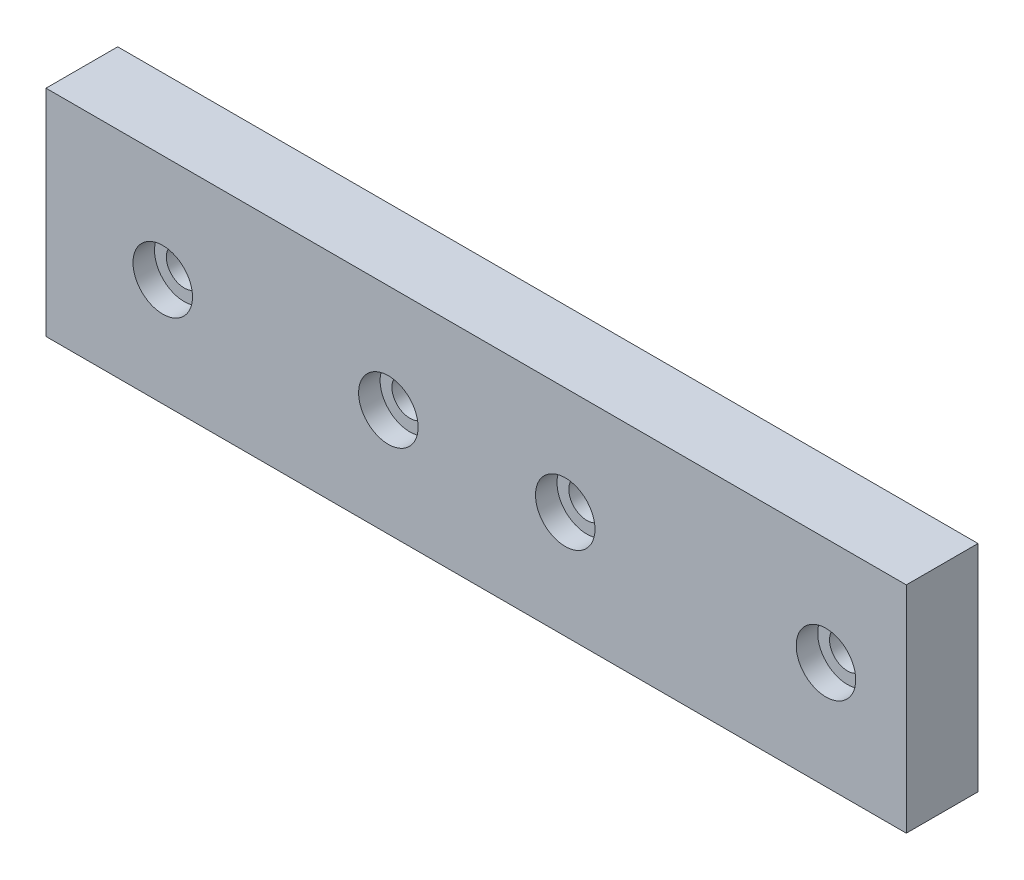
ISO-10303-21;
HEADER;
FILE_DESCRIPTION(('STEP AP214'),'2;1');
FILE_NAME('part.step','',(''),(''),'','','');
FILE_SCHEMA(('AUTOMOTIVE_DESIGN { 1 0 10303 214 1 1 1 1 }'));
ENDSEC;
DATA;
#1=APPLICATION_CONTEXT('core data for automotive mechanical design processes');
#2=APPLICATION_PROTOCOL_DEFINITION('international standard','automotive_design',2000,#1);
#3=PRODUCT_CONTEXT('',#1,'mechanical');
#4=PRODUCT('Part','Part','',(#3));
#5=PRODUCT_RELATED_PRODUCT_CATEGORY('part','',(#4));
#6=PRODUCT_DEFINITION_FORMATION('','',#4);
#7=PRODUCT_DEFINITION_CONTEXT('part definition',#1,'design');
#8=PRODUCT_DEFINITION('design','',#6,#7);
#9=PRODUCT_DEFINITION_SHAPE('','',#8);
#10=(LENGTH_UNIT() NAMED_UNIT(*) SI_UNIT(.MILLI.,.METRE.));
#11=(NAMED_UNIT(*) PLANE_ANGLE_UNIT() SI_UNIT($,.RADIAN.));
#12=(NAMED_UNIT(*) SI_UNIT($,.STERADIAN.) SOLID_ANGLE_UNIT());
#13=UNCERTAINTY_MEASURE_WITH_UNIT(LENGTH_MEASURE(1.E-05),#10,'distance_accuracy_value','');
#14=(GEOMETRIC_REPRESENTATION_CONTEXT(3) GLOBAL_UNCERTAINTY_ASSIGNED_CONTEXT((#13)) GLOBAL_UNIT_ASSIGNED_CONTEXT((#10,
#11,#12)) REPRESENTATION_CONTEXT('',''));
#15=CARTESIAN_POINT('',(0.,0.,0.));
#16=DIRECTION('',(0.,0.,1.));
#17=DIRECTION('',(1.,0.,0.));
#18=AXIS2_PLACEMENT_3D('',#15,#16,#17);
#19=CARTESIAN_POINT('',(-6.70657386989236,15.,40.));
#20=DIRECTION('',(0.,0.,-1.));
#21=DIRECTION('',(-1.,0.,0.));
#22=AXIS2_PLACEMENT_3D('',#19,#20,#21);
#23=CYLINDRICAL_SURFACE('',#22,2.5);
#24=CARTESIAN_POINT('',(-6.70657386989237,15.,17.5));
#25=DIRECTION('',(0.,0.,1.));
#26=DIRECTION('',(1.,0.,0.));
#27=AXIS2_PLACEMENT_3D('',#24,#25,#26);
#28=CIRCLE('',#27,2.5);
#29=CARTESIAN_POINT('',(-4.20657386989237,15.,17.5));
#30=VERTEX_POINT('',#29);
#31=EDGE_CURVE('E111',#30,#30,#28,.T.);
#32=ORIENTED_EDGE('',*,*,#31,.F.);
#33=EDGE_LOOP('',(#32));
#34=FACE_BOUND('',#33,.T.);
#35=CARTESIAN_POINT('',(-6.70657386989237,15.,24.5));
#36=DIRECTION('',(0.,0.,1.));
#37=DIRECTION('',(1.,0.,0.));
#38=AXIS2_PLACEMENT_3D('',#35,#36,#37);
#39=CIRCLE('',#38,2.5);
#40=CARTESIAN_POINT('',(-4.20657386989237,15.,24.5));
#41=VERTEX_POINT('',#40);
#42=EDGE_CURVE('E37',#41,#41,#39,.F.);
#43=ORIENTED_EDGE('',*,*,#42,.F.);
#44=EDGE_LOOP('',(#43));
#45=FACE_BOUND('',#44,.T.);
#46=ADVANCED_FACE('F33',(#34,#45),#23,.F.);
#47=CARTESIAN_POINT('',(-99.2164026591733,15.,40.));
#48=DIRECTION('',(0.,0.,-1.));
#49=DIRECTION('',(-1.,0.,0.));
#50=AXIS2_PLACEMENT_3D('',#47,#48,#49);
#51=CYLINDRICAL_SURFACE('',#50,2.5);
#52=CARTESIAN_POINT('',(-99.2164026591733,15.,17.5));
#53=DIRECTION('',(0.,0.,1.));
#54=DIRECTION('',(1.,0.,0.));
#55=AXIS2_PLACEMENT_3D('',#52,#53,#54);
#56=CIRCLE('',#55,2.5);
#57=CARTESIAN_POINT('',(-96.7164026591733,15.,17.5));
#58=VERTEX_POINT('',#57);
#59=EDGE_CURVE('E114',#58,#58,#56,.T.);
#60=ORIENTED_EDGE('',*,*,#59,.F.);
#61=EDGE_LOOP('',(#60));
#62=FACE_BOUND('',#61,.T.);
#63=CARTESIAN_POINT('',(-99.2164026591733,15.,24.5));
#64=DIRECTION('',(0.,0.,1.));
#65=DIRECTION('',(1.,0.,0.));
#66=AXIS2_PLACEMENT_3D('',#63,#64,#65);
#67=CIRCLE('',#66,2.5);
#68=CARTESIAN_POINT('',(-96.7164026591733,15.,24.5));
#69=VERTEX_POINT('',#68);
#70=EDGE_CURVE('E128',#69,#69,#67,.F.);
#71=ORIENTED_EDGE('',*,*,#70,.F.);
#72=EDGE_LOOP('',(#71));
#73=FACE_BOUND('',#72,.T.);
#74=ADVANCED_FACE('F138',(#62,#73),#51,.F.);
#75=CARTESIAN_POINT('',(-67.7461410245669,15.,40.));
#76=DIRECTION('',(0.,0.,-1.));
#77=DIRECTION('',(-1.,0.,0.));
#78=AXIS2_PLACEMENT_3D('',#75,#76,#77);
#79=CYLINDRICAL_SURFACE('',#78,2.50000000000001);
#80=CARTESIAN_POINT('',(-67.7461410245669,15.,17.5));
#81=DIRECTION('',(0.,0.,1.));
#82=DIRECTION('',(1.,0.,0.));
#83=AXIS2_PLACEMENT_3D('',#80,#81,#82);
#84=CIRCLE('',#83,2.50000000000001);
#85=CARTESIAN_POINT('',(-65.2461410245669,15.,17.5));
#86=VERTEX_POINT('',#85);
#87=EDGE_CURVE('E117',#86,#86,#84,.T.);
#88=ORIENTED_EDGE('',*,*,#87,.F.);
#89=EDGE_LOOP('',(#88));
#90=FACE_BOUND('',#89,.T.);
#91=CARTESIAN_POINT('',(-67.7461410245669,15.,24.5));
#92=DIRECTION('',(0.,0.,1.));
#93=DIRECTION('',(1.,0.,0.));
#94=AXIS2_PLACEMENT_3D('',#91,#92,#93);
#95=CIRCLE('',#94,2.50000000000001);
#96=CARTESIAN_POINT('',(-65.2461410245669,15.,24.5));
#97=VERTEX_POINT('',#96);
#98=EDGE_CURVE('E125',#97,#97,#95,.F.);
#99=ORIENTED_EDGE('',*,*,#98,.F.);
#100=EDGE_LOOP('',(#99));
#101=FACE_BOUND('',#100,.T.);
#102=ADVANCED_FACE('F144',(#90,#101),#79,.F.);
#103=CARTESIAN_POINT('',(-43.0740192619808,15.,40.));
#104=DIRECTION('',(0.,0.,-1.));
#105=DIRECTION('',(-1.,0.,0.));
#106=AXIS2_PLACEMENT_3D('',#103,#104,#105);
#107=CYLINDRICAL_SURFACE('',#106,2.5);
#108=CARTESIAN_POINT('',(-43.0740192619808,15.,17.5));
#109=DIRECTION('',(0.,0.,1.));
#110=DIRECTION('',(1.,0.,0.));
#111=AXIS2_PLACEMENT_3D('',#108,#109,#110);
#112=CIRCLE('',#111,2.5);
#113=CARTESIAN_POINT('',(-40.5740192619808,15.,17.5));
#114=VERTEX_POINT('',#113);
#115=EDGE_CURVE('E102',#114,#114,#112,.T.);
#116=ORIENTED_EDGE('',*,*,#115,.F.);
#117=EDGE_LOOP('',(#116));
#118=FACE_BOUND('',#117,.T.);
#119=CARTESIAN_POINT('',(-43.0740192619808,15.,24.5));
#120=DIRECTION('',(0.,0.,1.));
#121=DIRECTION('',(1.,0.,0.));
#122=AXIS2_PLACEMENT_3D('',#119,#120,#121);
#123=CIRCLE('',#122,2.5);
#124=CARTESIAN_POINT('',(-40.5740192619808,15.,24.5));
#125=VERTEX_POINT('',#124);
#126=EDGE_CURVE('E122',#125,#125,#123,.F.);
#127=ORIENTED_EDGE('',*,*,#126,.F.);
#128=EDGE_LOOP('',(#127));
#129=FACE_BOUND('',#128,.T.);
#130=ADVANCED_FACE('F166',(#118,#129),#107,.F.);
#131=CARTESIAN_POINT('',(-115.498945947558,0.,27.5));
#132=DIRECTION('',(0.,1.,0.));
#133=DIRECTION('',(-1.,0.,0.));
#134=AXIS2_PLACEMENT_3D('',#131,#132,#133);
#135=PLANE('',#134);
#136=DIRECTION('',(1.,0.,0.));
#137=VECTOR('',#136,1.);
#138=CARTESIAN_POINT('',(-115.498945947558,0.,17.5));
#139=LINE('',#138,#137);
#140=CARTESIAN_POINT('',(-115.498945947558,0.,17.5));
#141=VERTEX_POINT('',#140);
#142=CARTESIAN_POINT('',(4.50105405244178,0.,17.5));
#143=VERTEX_POINT('',#142);
#144=EDGE_CURVE('E100',#141,#143,#139,.T.);
#145=ORIENTED_EDGE('',*,*,#144,.T.);
#146=DIRECTION('',(0.,0.,-1.));
#147=VECTOR('',#146,1.);
#148=CARTESIAN_POINT('',(4.50105405244178,0.,27.5));
#149=LINE('',#148,#147);
#150=CARTESIAN_POINT('',(4.50105405244178,0.,27.5));
#151=VERTEX_POINT('',#150);
#152=EDGE_CURVE('E11',#151,#143,#149,.T.);
#153=ORIENTED_EDGE('',*,*,#152,.F.);
#154=DIRECTION('',(1.,0.,0.));
#155=VECTOR('',#154,1.);
#156=CARTESIAN_POINT('',(-115.498945947558,0.,27.5));
#157=LINE('',#156,#155);
#158=CARTESIAN_POINT('',(-115.498945947558,0.,27.5));
#159=VERTEX_POINT('',#158);
#160=EDGE_CURVE('E85',#159,#151,#157,.T.);
#161=ORIENTED_EDGE('',*,*,#160,.F.);
#162=DIRECTION('',(0.,0.,-1.));
#163=VECTOR('',#162,1.);
#164=CARTESIAN_POINT('',(-115.498945947558,0.,27.5));
#165=LINE('',#164,#163);
#166=EDGE_CURVE('E52',#159,#141,#165,.T.);
#167=ORIENTED_EDGE('',*,*,#166,.T.);
#168=EDGE_LOOP('',(#145,#153,#161,#167));
#169=FACE_BOUND('',#168,.T.);
#170=ADVANCED_FACE('F35',(#169),#135,.F.);
#171=CARTESIAN_POINT('',(4.50105405244178,0.,27.5));
#172=DIRECTION('',(-1.,0.,0.));
#173=DIRECTION('',(0.,0.,1.));
#174=AXIS2_PLACEMENT_3D('',#171,#172,#173);
#175=PLANE('',#174);
#176=DIRECTION('',(0.,1.,0.));
#177=VECTOR('',#176,1.);
#178=CARTESIAN_POINT('',(4.50105405244178,0.,17.5));
#179=LINE('',#178,#177);
#180=CARTESIAN_POINT('',(4.50105405244178,30.,17.5));
#181=VERTEX_POINT('',#180);
#182=EDGE_CURVE('E90',#143,#181,#179,.T.);
#183=ORIENTED_EDGE('',*,*,#182,.T.);
#184=DIRECTION('',(0.,0.,-1.));
#185=VECTOR('',#184,1.);
#186=CARTESIAN_POINT('',(4.50105405244178,30.,27.5));
#187=LINE('',#186,#185);
#188=CARTESIAN_POINT('',(4.50105405244178,30.,27.5));
#189=VERTEX_POINT('',#188);
#190=EDGE_CURVE('E43',#189,#181,#187,.T.);
#191=ORIENTED_EDGE('',*,*,#190,.F.);
#192=DIRECTION('',(0.,1.,0.));
#193=VECTOR('',#192,1.);
#194=CARTESIAN_POINT('',(4.50105405244178,0.,27.5));
#195=LINE('',#194,#193);
#196=EDGE_CURVE('E77',#151,#189,#195,.T.);
#197=ORIENTED_EDGE('',*,*,#196,.F.);
#198=ORIENTED_EDGE('',*,*,#152,.T.);
#199=EDGE_LOOP('',(#183,#191,#197,#198));
#200=FACE_BOUND('',#199,.T.);
#201=ADVANCED_FACE('F89',(#200),#175,.F.);
#202=CARTESIAN_POINT('',(-115.498945947558,30.,27.5));
#203=DIRECTION('',(0.,1.,0.));
#204=DIRECTION('',(0.,0.,1.));
#205=AXIS2_PLACEMENT_3D('',#202,#203,#204);
#206=PLANE('',#205);
#207=DIRECTION('',(1.,0.,0.));
#208=VECTOR('',#207,1.);
#209=CARTESIAN_POINT('',(-115.498945947558,30.,17.5));
#210=LINE('',#209,#208);
#211=CARTESIAN_POINT('',(-115.498945947558,30.,17.5));
#212=VERTEX_POINT('',#211);
#213=EDGE_CURVE('E104',#212,#181,#210,.T.);
#214=ORIENTED_EDGE('',*,*,#213,.F.);
#215=DIRECTION('',(0.,0.,-1.));
#216=VECTOR('',#215,1.);
#217=CARTESIAN_POINT('',(-115.498945947558,30.,27.5));
#218=LINE('',#217,#216);
#219=CARTESIAN_POINT('',(-115.498945947558,30.,27.5));
#220=VERTEX_POINT('',#219);
#221=EDGE_CURVE('E66',#220,#212,#218,.T.);
#222=ORIENTED_EDGE('',*,*,#221,.F.);
#223=DIRECTION('',(1.,0.,0.));
#224=VECTOR('',#223,1.);
#225=CARTESIAN_POINT('',(-115.498945947558,30.,27.5));
#226=LINE('',#225,#224);
#227=EDGE_CURVE('E84',#220,#189,#226,.T.);
#228=ORIENTED_EDGE('',*,*,#227,.T.);
#229=ORIENTED_EDGE('',*,*,#190,.T.);
#230=EDGE_LOOP('',(#214,#222,#228,#229));
#231=FACE_BOUND('',#230,.T.);
#232=ADVANCED_FACE('F94',(#231),#206,.T.);
#233=CARTESIAN_POINT('',(-115.498945947558,0.,27.5));
#234=DIRECTION('',(-1.,0.,0.));
#235=DIRECTION('',(0.,0.,1.));
#236=AXIS2_PLACEMENT_3D('',#233,#234,#235);
#237=PLANE('',#236);
#238=DIRECTION('',(0.,1.,0.));
#239=VECTOR('',#238,1.);
#240=CARTESIAN_POINT('',(-115.498945947558,0.,17.5));
#241=LINE('',#240,#239);
#242=EDGE_CURVE('E106',#141,#212,#241,.T.);
#243=ORIENTED_EDGE('',*,*,#242,.F.);
#244=ORIENTED_EDGE('',*,*,#166,.F.);
#245=DIRECTION('',(0.,1.,0.));
#246=VECTOR('',#245,1.);
#247=CARTESIAN_POINT('',(-115.498945947558,0.,27.5));
#248=LINE('',#247,#246);
#249=EDGE_CURVE('E95',#159,#220,#248,.T.);
#250=ORIENTED_EDGE('',*,*,#249,.T.);
#251=ORIENTED_EDGE('',*,*,#221,.T.);
#252=EDGE_LOOP('',(#243,#244,#250,#251));
#253=FACE_BOUND('',#252,.T.);
#254=ADVANCED_FACE('F153',(#253),#237,.T.);
#255=CARTESIAN_POINT('',(0.,0.,27.5));
#256=DIRECTION('',(0.,0.,1.));
#257=DIRECTION('',(1.,0.,0.));
#258=AXIS2_PLACEMENT_3D('',#255,#256,#257);
#259=PLANE('',#258);
#260=CARTESIAN_POINT('',(-6.70657386989237,15.,27.5));
#261=DIRECTION('',(0.,0.,1.));
#262=DIRECTION('',(1.,0.,0.));
#263=AXIS2_PLACEMENT_3D('',#260,#261,#262);
#264=CIRCLE('',#263,4.15);
#265=CARTESIAN_POINT('',(-2.55657386989237,15.,27.5));
#266=VERTEX_POINT('',#265);
#267=EDGE_CURVE('E180',#266,#266,#264,.T.);
#268=ORIENTED_EDGE('',*,*,#267,.F.);
#269=EDGE_LOOP('',(#268));
#270=FACE_BOUND('',#269,.T.);
#271=CARTESIAN_POINT('',(-99.2164026591733,15.,27.5));
#272=DIRECTION('',(0.,0.,1.));
#273=DIRECTION('',(1.,0.,0.));
#274=AXIS2_PLACEMENT_3D('',#271,#272,#273);
#275=CIRCLE('',#274,4.15);
#276=CARTESIAN_POINT('',(-95.0664026591733,15.,27.5));
#277=VERTEX_POINT('',#276);
#278=EDGE_CURVE('E186',#277,#277,#275,.T.);
#279=ORIENTED_EDGE('',*,*,#278,.F.);
#280=EDGE_LOOP('',(#279));
#281=FACE_BOUND('',#280,.T.);
#282=CARTESIAN_POINT('',(-43.0740192619808,15.,27.5));
#283=DIRECTION('',(0.,0.,1.));
#284=DIRECTION('',(1.,0.,0.));
#285=AXIS2_PLACEMENT_3D('',#282,#283,#284);
#286=CIRCLE('',#285,4.15);
#287=CARTESIAN_POINT('',(-38.9240192619808,15.,27.5));
#288=VERTEX_POINT('',#287);
#289=EDGE_CURVE('E192',#288,#288,#286,.T.);
#290=ORIENTED_EDGE('',*,*,#289,.F.);
#291=EDGE_LOOP('',(#290));
#292=FACE_BOUND('',#291,.T.);
#293=CARTESIAN_POINT('',(-67.7461410245669,15.,27.5));
#294=DIRECTION('',(0.,0.,1.));
#295=DIRECTION('',(1.,0.,0.));
#296=AXIS2_PLACEMENT_3D('',#293,#294,#295);
#297=CIRCLE('',#296,4.15);
#298=CARTESIAN_POINT('',(-63.5961410245669,15.,27.5));
#299=VERTEX_POINT('',#298);
#300=EDGE_CURVE('E174',#299,#299,#297,.T.);
#301=ORIENTED_EDGE('',*,*,#300,.F.);
#302=EDGE_LOOP('',(#301));
#303=FACE_BOUND('',#302,.T.);
#304=ORIENTED_EDGE('',*,*,#160,.T.);
#305=ORIENTED_EDGE('',*,*,#196,.T.);
#306=ORIENTED_EDGE('',*,*,#227,.F.);
#307=ORIENTED_EDGE('',*,*,#249,.F.);
#308=EDGE_LOOP('',(#304,#305,#306,#307));
#309=FACE_BOUND('',#308,.T.);
#310=ADVANCED_FACE('F81',(#270,#281,#292,#303,#309),#259,.T.);
#311=CARTESIAN_POINT('',(0.,0.,17.5));
#312=DIRECTION('',(0.,0.,1.));
#313=DIRECTION('',(1.,0.,0.));
#314=AXIS2_PLACEMENT_3D('',#311,#312,#313);
#315=PLANE('',#314);
#316=ORIENTED_EDGE('',*,*,#115,.T.);
#317=EDGE_LOOP('',(#316));
#318=FACE_BOUND('',#317,.T.);
#319=ORIENTED_EDGE('',*,*,#87,.T.);
#320=EDGE_LOOP('',(#319));
#321=FACE_BOUND('',#320,.T.);
#322=ORIENTED_EDGE('',*,*,#59,.T.);
#323=EDGE_LOOP('',(#322));
#324=FACE_BOUND('',#323,.T.);
#325=ORIENTED_EDGE('',*,*,#31,.T.);
#326=EDGE_LOOP('',(#325));
#327=FACE_BOUND('',#326,.T.);
#328=ORIENTED_EDGE('',*,*,#144,.F.);
#329=ORIENTED_EDGE('',*,*,#242,.T.);
#330=ORIENTED_EDGE('',*,*,#213,.T.);
#331=ORIENTED_EDGE('',*,*,#182,.F.);
#332=EDGE_LOOP('',(#328,#329,#330,#331));
#333=FACE_BOUND('',#332,.T.);
#334=ADVANCED_FACE('F152',(#318,#321,#324,#327,#333),#315,.F.);
#335=CARTESIAN_POINT('',(-43.0740192619808,15.,24.5));
#336=DIRECTION('',(0.,0.,1.));
#337=DIRECTION('',(1.,0.,0.));
#338=AXIS2_PLACEMENT_3D('',#335,#336,#337);
#339=PLANE('',#338);
#340=CARTESIAN_POINT('',(-43.0740192619808,15.,24.5));
#341=DIRECTION('',(0.,0.,1.));
#342=DIRECTION('',(1.,0.,0.));
#343=AXIS2_PLACEMENT_3D('',#340,#341,#342);
#344=CIRCLE('',#343,4.15);
#345=CARTESIAN_POINT('',(-38.9240192619808,15.,24.5));
#346=VERTEX_POINT('',#345);
#347=EDGE_CURVE('E177',#346,#346,#344,.T.);
#348=ORIENTED_EDGE('',*,*,#347,.T.);
#349=EDGE_LOOP('',(#348));
#350=FACE_BOUND('',#349,.T.);
#351=ORIENTED_EDGE('',*,*,#126,.T.);
#352=EDGE_LOOP('',(#351));
#353=FACE_BOUND('',#352,.T.);
#354=ADVANCED_FACE('F157',(#350,#353),#339,.T.);
#355=CARTESIAN_POINT('',(-43.0740192619808,15.,24.5));
#356=DIRECTION('',(0.,0.,1.));
#357=DIRECTION('',(1.,0.,0.));
#358=AXIS2_PLACEMENT_3D('',#355,#356,#357);
#359=CYLINDRICAL_SURFACE('',#358,4.15);
#360=ORIENTED_EDGE('',*,*,#347,.F.);
#361=EDGE_LOOP('',(#360));
#362=FACE_BOUND('',#361,.T.);
#363=ORIENTED_EDGE('',*,*,#289,.T.);
#364=EDGE_LOOP('',(#363));
#365=FACE_BOUND('',#364,.T.);
#366=ADVANCED_FACE('F200',(#362,#365),#359,.F.);
#367=CARTESIAN_POINT('',(-67.7461410245669,15.,24.5));
#368=DIRECTION('',(0.,0.,1.));
#369=DIRECTION('',(1.,0.,0.));
#370=AXIS2_PLACEMENT_3D('',#367,#368,#369);
#371=PLANE('',#370);
#372=CARTESIAN_POINT('',(-67.7461410245669,15.,24.5));
#373=DIRECTION('',(0.,0.,1.));
#374=DIRECTION('',(1.,0.,0.));
#375=AXIS2_PLACEMENT_3D('',#372,#373,#374);
#376=CIRCLE('',#375,4.15);
#377=CARTESIAN_POINT('',(-63.5961410245669,15.,24.5));
#378=VERTEX_POINT('',#377);
#379=EDGE_CURVE('E126',#378,#378,#376,.T.);
#380=ORIENTED_EDGE('',*,*,#379,.T.);
#381=EDGE_LOOP('',(#380));
#382=FACE_BOUND('',#381,.T.);
#383=ORIENTED_EDGE('',*,*,#98,.T.);
#384=EDGE_LOOP('',(#383));
#385=FACE_BOUND('',#384,.T.);
#386=ADVANCED_FACE('F203',(#382,#385),#371,.T.);
#387=CARTESIAN_POINT('',(-67.7461410245669,15.,24.5));
#388=DIRECTION('',(0.,0.,1.));
#389=DIRECTION('',(1.,0.,0.));
#390=AXIS2_PLACEMENT_3D('',#387,#388,#389);
#391=CYLINDRICAL_SURFACE('',#390,4.15);
#392=ORIENTED_EDGE('',*,*,#379,.F.);
#393=EDGE_LOOP('',(#392));
#394=FACE_BOUND('',#393,.T.);
#395=ORIENTED_EDGE('',*,*,#300,.T.);
#396=EDGE_LOOP('',(#395));
#397=FACE_BOUND('',#396,.T.);
#398=ADVANCED_FACE('F210',(#394,#397),#391,.F.);
#399=CARTESIAN_POINT('',(-99.2164026591733,15.,24.5));
#400=DIRECTION('',(0.,0.,1.));
#401=DIRECTION('',(1.,0.,0.));
#402=AXIS2_PLACEMENT_3D('',#399,#400,#401);
#403=PLANE('',#402);
#404=CARTESIAN_POINT('',(-99.2164026591733,15.,24.5));
#405=DIRECTION('',(0.,0.,1.));
#406=DIRECTION('',(1.,0.,0.));
#407=AXIS2_PLACEMENT_3D('',#404,#405,#406);
#408=CIRCLE('',#407,4.15);
#409=CARTESIAN_POINT('',(-95.0664026591733,15.,24.5));
#410=VERTEX_POINT('',#409);
#411=EDGE_CURVE('E189',#410,#410,#408,.T.);
#412=ORIENTED_EDGE('',*,*,#411,.T.);
#413=EDGE_LOOP('',(#412));
#414=FACE_BOUND('',#413,.T.);
#415=ORIENTED_EDGE('',*,*,#70,.T.);
#416=EDGE_LOOP('',(#415));
#417=FACE_BOUND('',#416,.T.);
#418=ADVANCED_FACE('F212',(#414,#417),#403,.T.);
#419=CARTESIAN_POINT('',(-99.2164026591733,15.,24.5));
#420=DIRECTION('',(0.,0.,1.));
#421=DIRECTION('',(1.,0.,0.));
#422=AXIS2_PLACEMENT_3D('',#419,#420,#421);
#423=CYLINDRICAL_SURFACE('',#422,4.15);
#424=ORIENTED_EDGE('',*,*,#411,.F.);
#425=EDGE_LOOP('',(#424));
#426=FACE_BOUND('',#425,.T.);
#427=ORIENTED_EDGE('',*,*,#278,.T.);
#428=EDGE_LOOP('',(#427));
#429=FACE_BOUND('',#428,.T.);
#430=ADVANCED_FACE('F219',(#426,#429),#423,.F.);
#431=CARTESIAN_POINT('',(-6.70657386989237,15.,24.5));
#432=DIRECTION('',(0.,0.,1.));
#433=DIRECTION('',(1.,0.,0.));
#434=AXIS2_PLACEMENT_3D('',#431,#432,#433);
#435=PLANE('',#434);
#436=CARTESIAN_POINT('',(-6.70657386989237,15.,24.5));
#437=DIRECTION('',(0.,0.,1.));
#438=DIRECTION('',(1.,0.,0.));
#439=AXIS2_PLACEMENT_3D('',#436,#437,#438);
#440=CIRCLE('',#439,4.15);
#441=CARTESIAN_POINT('',(-2.55657386989237,15.,24.5));
#442=VERTEX_POINT('',#441);
#443=EDGE_CURVE('E183',#442,#442,#440,.T.);
#444=ORIENTED_EDGE('',*,*,#443,.T.);
#445=EDGE_LOOP('',(#444));
#446=FACE_BOUND('',#445,.T.);
#447=ORIENTED_EDGE('',*,*,#42,.T.);
#448=EDGE_LOOP('',(#447));
#449=FACE_BOUND('',#448,.T.);
#450=ADVANCED_FACE('F135',(#446,#449),#435,.T.);
#451=CARTESIAN_POINT('',(-6.70657386989237,15.,24.5));
#452=DIRECTION('',(0.,0.,1.));
#453=DIRECTION('',(1.,0.,0.));
#454=AXIS2_PLACEMENT_3D('',#451,#452,#453);
#455=CYLINDRICAL_SURFACE('',#454,4.15);
#456=ORIENTED_EDGE('',*,*,#443,.F.);
#457=EDGE_LOOP('',(#456));
#458=FACE_BOUND('',#457,.T.);
#459=ORIENTED_EDGE('',*,*,#267,.T.);
#460=EDGE_LOOP('',(#459));
#461=FACE_BOUND('',#460,.T.);
#462=ADVANCED_FACE('F328',(#458,#461),#455,.F.);
#463=CLOSED_SHELL('',(#46,#74,#102,#130,#170,#201,#232,#254,#310,#334,#354,#366,#386,#398,#418,
#430,#450,#462));
#464=MANIFOLD_SOLID_BREP('B2',#463);
#465=ADVANCED_BREP_SHAPE_REPRESENTATION('',(#18,#464),#14);
#466=SHAPE_DEFINITION_REPRESENTATION(#9,#465);
ENDSEC;
END-ISO-10303-21;
